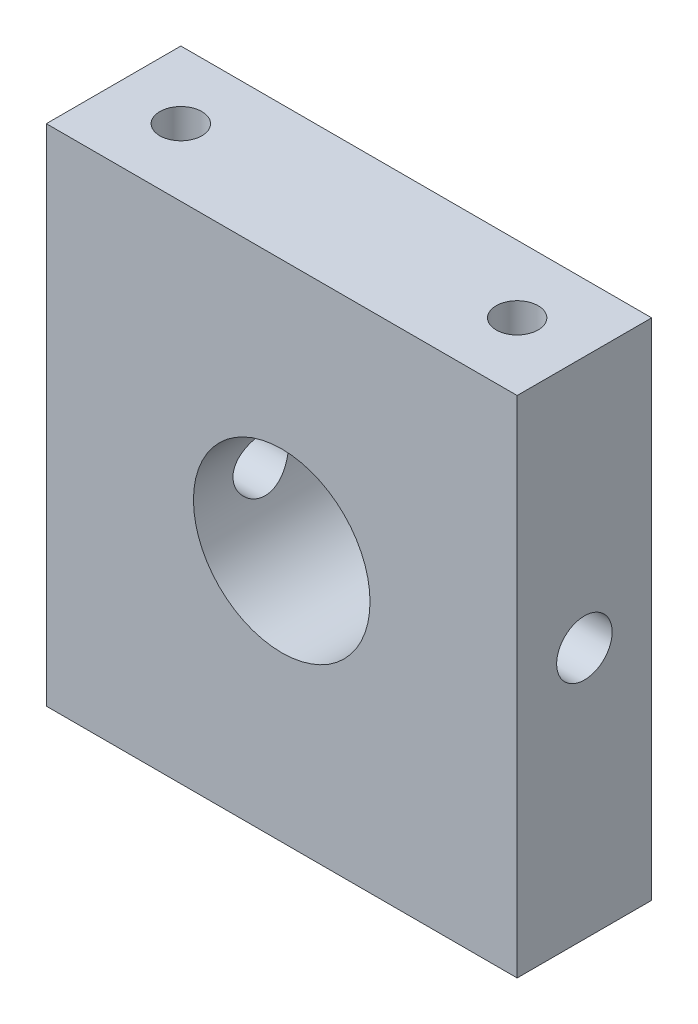
ISO-10303-21;
HEADER;
FILE_DESCRIPTION(('STEP AP214'),'2;1');
FILE_NAME('part.step','',(''),(''),'','','');
FILE_SCHEMA(('AUTOMOTIVE_DESIGN { 1 0 10303 214 1 1 1 1 }'));
ENDSEC;
DATA;
#1=APPLICATION_CONTEXT('core data for automotive mechanical design processes');
#2=APPLICATION_PROTOCOL_DEFINITION('international standard','automotive_design',2000,#1);
#3=PRODUCT_CONTEXT('',#1,'mechanical');
#4=PRODUCT('Part','Part','',(#3));
#5=PRODUCT_RELATED_PRODUCT_CATEGORY('part','',(#4));
#6=PRODUCT_DEFINITION_FORMATION('','',#4);
#7=PRODUCT_DEFINITION_CONTEXT('part definition',#1,'design');
#8=PRODUCT_DEFINITION('design','',#6,#7);
#9=PRODUCT_DEFINITION_SHAPE('','',#8);
#10=(LENGTH_UNIT() NAMED_UNIT(*) SI_UNIT(.MILLI.,.METRE.));
#11=(NAMED_UNIT(*) PLANE_ANGLE_UNIT() SI_UNIT($,.RADIAN.));
#12=(NAMED_UNIT(*) SI_UNIT($,.STERADIAN.) SOLID_ANGLE_UNIT());
#13=UNCERTAINTY_MEASURE_WITH_UNIT(LENGTH_MEASURE(1.E-05),#10,'distance_accuracy_value','');
#14=(GEOMETRIC_REPRESENTATION_CONTEXT(3) GLOBAL_UNCERTAINTY_ASSIGNED_CONTEXT((#13)) GLOBAL_UNIT_ASSIGNED_CONTEXT((#10,
#11,#12)) REPRESENTATION_CONTEXT('',''));
#15=CARTESIAN_POINT('',(0.,0.,0.));
#16=DIRECTION('',(0.,0.,1.));
#17=DIRECTION('',(1.,0.,0.));
#18=AXIS2_PLACEMENT_3D('',#15,#16,#17);
#19=CARTESIAN_POINT('',(0.,0.,8.));
#20=DIRECTION('',(0.,0.,-1.));
#21=DIRECTION('',(-1.,0.,0.));
#22=AXIS2_PLACEMENT_3D('',#19,#20,#21);
#23=PLANE('',#22);
#24=DIRECTION('',(0.,1.,0.));
#25=VECTOR('',#24,1.);
#26=CARTESIAN_POINT('',(14.,-15.,8.));
#27=LINE('',#26,#25);
#28=CARTESIAN_POINT('',(14.,-15.,8.));
#29=VERTEX_POINT('',#28);
#30=CARTESIAN_POINT('',(14.,15.,8.));
#31=VERTEX_POINT('',#30);
#32=EDGE_CURVE('E146',#29,#31,#27,.T.);
#33=ORIENTED_EDGE('',*,*,#32,.T.);
#34=DIRECTION('',(-1.,0.,0.));
#35=VECTOR('',#34,1.);
#36=CARTESIAN_POINT('',(-14.,15.,8.));
#37=LINE('',#36,#35);
#38=CARTESIAN_POINT('',(-14.,15.,8.));
#39=VERTEX_POINT('',#38);
#40=EDGE_CURVE('E92',#31,#39,#37,.T.);
#41=ORIENTED_EDGE('',*,*,#40,.T.);
#42=DIRECTION('',(0.,-1.,0.));
#43=VECTOR('',#42,1.);
#44=CARTESIAN_POINT('',(-14.,-15.,8.));
#45=LINE('',#44,#43);
#46=CARTESIAN_POINT('',(-14.,-15.,8.));
#47=VERTEX_POINT('',#46);
#48=EDGE_CURVE('E149',#39,#47,#45,.T.);
#49=ORIENTED_EDGE('',*,*,#48,.T.);
#50=DIRECTION('',(1.,0.,0.));
#51=VECTOR('',#50,1.);
#52=CARTESIAN_POINT('',(-14.,-15.,8.));
#53=LINE('',#52,#51);
#54=EDGE_CURVE('E61',#47,#29,#53,.T.);
#55=ORIENTED_EDGE('',*,*,#54,.T.);
#56=EDGE_LOOP('',(#33,#41,#49,#55));
#57=FACE_BOUND('',#56,.T.);
#58=CARTESIAN_POINT('',(0.,0.,8.));
#59=DIRECTION('',(0.,0.,1.));
#60=DIRECTION('',(1.,0.,0.));
#61=AXIS2_PLACEMENT_3D('',#58,#59,#60);
#62=CIRCLE('',#61,5.25);
#63=CARTESIAN_POINT('',(5.25,0.,8.));
#64=VERTEX_POINT('',#63);
#65=EDGE_CURVE('E140',#64,#64,#62,.T.);
#66=ORIENTED_EDGE('',*,*,#65,.F.);
#67=EDGE_LOOP('',(#66));
#68=FACE_BOUND('',#67,.T.);
#69=ADVANCED_FACE('F38',(#57,#68),#23,.F.);
#70=CARTESIAN_POINT('',(0.,0.,0.));
#71=DIRECTION('',(0.,0.,-1.));
#72=DIRECTION('',(-1.,0.,0.));
#73=AXIS2_PLACEMENT_3D('',#70,#71,#72);
#74=PLANE('',#73);
#75=DIRECTION('',(0.,1.,0.));
#76=VECTOR('',#75,1.);
#77=CARTESIAN_POINT('',(14.,-15.,0.));
#78=LINE('',#77,#76);
#79=CARTESIAN_POINT('',(14.,-15.,0.));
#80=VERTEX_POINT('',#79);
#81=CARTESIAN_POINT('',(14.,15.,0.));
#82=VERTEX_POINT('',#81);
#83=EDGE_CURVE('E143',#80,#82,#78,.T.);
#84=ORIENTED_EDGE('',*,*,#83,.F.);
#85=DIRECTION('',(1.,0.,0.));
#86=VECTOR('',#85,1.);
#87=CARTESIAN_POINT('',(-14.,-15.,0.));
#88=LINE('',#87,#86);
#89=CARTESIAN_POINT('',(-14.,-15.,0.));
#90=VERTEX_POINT('',#89);
#91=EDGE_CURVE('E85',#90,#80,#88,.T.);
#92=ORIENTED_EDGE('',*,*,#91,.F.);
#93=DIRECTION('',(0.,-1.,0.));
#94=VECTOR('',#93,1.);
#95=CARTESIAN_POINT('',(-14.,-15.,0.));
#96=LINE('',#95,#94);
#97=CARTESIAN_POINT('',(-14.,15.,0.));
#98=VERTEX_POINT('',#97);
#99=EDGE_CURVE('E79',#98,#90,#96,.T.);
#100=ORIENTED_EDGE('',*,*,#99,.F.);
#101=DIRECTION('',(-1.,0.,0.));
#102=VECTOR('',#101,1.);
#103=CARTESIAN_POINT('',(-14.,15.,0.));
#104=LINE('',#103,#102);
#105=EDGE_CURVE('E155',#82,#98,#104,.T.);
#106=ORIENTED_EDGE('',*,*,#105,.F.);
#107=EDGE_LOOP('',(#84,#92,#100,#106));
#108=FACE_BOUND('',#107,.T.);
#109=CARTESIAN_POINT('',(0.,0.,0.));
#110=DIRECTION('',(0.,0.,1.));
#111=DIRECTION('',(1.,0.,0.));
#112=AXIS2_PLACEMENT_3D('',#109,#110,#111);
#113=CIRCLE('',#112,5.25);
#114=CARTESIAN_POINT('',(5.25,0.,0.));
#115=VERTEX_POINT('',#114);
#116=EDGE_CURVE('E139',#115,#115,#113,.T.);
#117=ORIENTED_EDGE('',*,*,#116,.T.);
#118=EDGE_LOOP('',(#117));
#119=FACE_BOUND('',#118,.T.);
#120=ADVANCED_FACE('F208',(#108,#119),#74,.T.);
#121=CARTESIAN_POINT('',(14.,-15.,8.));
#122=DIRECTION('',(-1.,0.,0.));
#123=DIRECTION('',(0.,0.,1.));
#124=AXIS2_PLACEMENT_3D('',#121,#122,#123);
#125=PLANE('',#124);
#126=CARTESIAN_POINT('',(14.,0.,4.));
#127=DIRECTION('',(1.,0.,0.));
#128=DIRECTION('',(0.,0.,-1.));
#129=AXIS2_PLACEMENT_3D('',#126,#127,#128);
#130=CIRCLE('',#129,1.64999999999999);
#131=CARTESIAN_POINT('',(14.,0.,2.35000000000001));
#132=VERTEX_POINT('',#131);
#133=EDGE_CURVE('E246',#132,#132,#130,.T.);
#134=ORIENTED_EDGE('',*,*,#133,.F.);
#135=EDGE_LOOP('',(#134));
#136=FACE_BOUND('',#135,.T.);
#137=ORIENTED_EDGE('',*,*,#83,.T.);
#138=DIRECTION('',(0.,0.,-1.));
#139=VECTOR('',#138,1.);
#140=CARTESIAN_POINT('',(14.,15.,8.));
#141=LINE('',#140,#139);
#142=EDGE_CURVE('E11',#31,#82,#141,.T.);
#143=ORIENTED_EDGE('',*,*,#142,.F.);
#144=ORIENTED_EDGE('',*,*,#32,.F.);
#145=DIRECTION('',(0.,0.,-1.));
#146=VECTOR('',#145,1.);
#147=CARTESIAN_POINT('',(14.,-15.,8.));
#148=LINE('',#147,#146);
#149=EDGE_CURVE('E152',#29,#80,#148,.T.);
#150=ORIENTED_EDGE('',*,*,#149,.T.);
#151=EDGE_LOOP('',(#137,#143,#144,#150));
#152=FACE_BOUND('',#151,.T.);
#153=ADVANCED_FACE('F40',(#136,#152),#125,.F.);
#154=CARTESIAN_POINT('',(-14.,15.,8.));
#155=DIRECTION('',(0.,-1.,0.));
#156=DIRECTION('',(0.,0.,-1.));
#157=AXIS2_PLACEMENT_3D('',#154,#155,#156);
#158=PLANE('',#157);
#159=CARTESIAN_POINT('',(-10.,15.,4.));
#160=DIRECTION('',(0.,1.,0.));
#161=DIRECTION('',(0.,0.,1.));
#162=AXIS2_PLACEMENT_3D('',#159,#160,#161);
#163=CIRCLE('',#162,1.24999999999999);
#164=CARTESIAN_POINT('',(-10.,15.,5.24999999999999));
#165=VERTEX_POINT('',#164);
#166=EDGE_CURVE('E127',#165,#165,#163,.T.);
#167=ORIENTED_EDGE('',*,*,#166,.F.);
#168=EDGE_LOOP('',(#167));
#169=FACE_BOUND('',#168,.T.);
#170=CARTESIAN_POINT('',(10.,15.,4.));
#171=DIRECTION('',(0.,1.,0.));
#172=DIRECTION('',(0.,0.,1.));
#173=AXIS2_PLACEMENT_3D('',#170,#171,#172);
#174=CIRCLE('',#173,1.24999999999999);
#175=CARTESIAN_POINT('',(10.,15.,5.24999999999999));
#176=VERTEX_POINT('',#175);
#177=EDGE_CURVE('E133',#176,#176,#174,.T.);
#178=ORIENTED_EDGE('',*,*,#177,.F.);
#179=EDGE_LOOP('',(#178));
#180=FACE_BOUND('',#179,.T.);
#181=ORIENTED_EDGE('',*,*,#105,.T.);
#182=DIRECTION('',(0.,0.,-1.));
#183=VECTOR('',#182,1.);
#184=CARTESIAN_POINT('',(-14.,15.,8.));
#185=LINE('',#184,#183);
#186=EDGE_CURVE('E52',#39,#98,#185,.T.);
#187=ORIENTED_EDGE('',*,*,#186,.F.);
#188=ORIENTED_EDGE('',*,*,#40,.F.);
#189=ORIENTED_EDGE('',*,*,#142,.T.);
#190=EDGE_LOOP('',(#181,#187,#188,#189));
#191=FACE_BOUND('',#190,.T.);
#192=ADVANCED_FACE('F221',(#169,#180,#191),#158,.F.);
#193=CARTESIAN_POINT('',(-14.,-15.,8.));
#194=DIRECTION('',(1.,0.,0.));
#195=DIRECTION('',(0.,0.,-1.));
#196=AXIS2_PLACEMENT_3D('',#193,#194,#195);
#197=PLANE('',#196);
#198=CARTESIAN_POINT('',(-14.,0.,4.));
#199=DIRECTION('',(1.,0.,0.));
#200=DIRECTION('',(0.,0.,-1.));
#201=AXIS2_PLACEMENT_3D('',#198,#199,#200);
#202=CIRCLE('',#201,1.65);
#203=CARTESIAN_POINT('',(-14.,0.,2.35));
#204=VERTEX_POINT('',#203);
#205=EDGE_CURVE('E166',#204,#204,#202,.T.);
#206=ORIENTED_EDGE('',*,*,#205,.T.);
#207=EDGE_LOOP('',(#206));
#208=FACE_BOUND('',#207,.T.);
#209=ORIENTED_EDGE('',*,*,#99,.T.);
#210=DIRECTION('',(0.,0.,-1.));
#211=VECTOR('',#210,1.);
#212=CARTESIAN_POINT('',(-14.,-15.,8.));
#213=LINE('',#212,#211);
#214=EDGE_CURVE('E160',#47,#90,#213,.T.);
#215=ORIENTED_EDGE('',*,*,#214,.F.);
#216=ORIENTED_EDGE('',*,*,#48,.F.);
#217=ORIENTED_EDGE('',*,*,#186,.T.);
#218=EDGE_LOOP('',(#209,#215,#216,#217));
#219=FACE_BOUND('',#218,.T.);
#220=ADVANCED_FACE('F218',(#208,#219),#197,.F.);
#221=CARTESIAN_POINT('',(-14.,-15.,8.));
#222=DIRECTION('',(0.,1.,0.));
#223=DIRECTION('',(0.,0.,1.));
#224=AXIS2_PLACEMENT_3D('',#221,#222,#223);
#225=PLANE('',#224);
#226=CARTESIAN_POINT('',(-10.,-15.,4.));
#227=DIRECTION('',(0.,-1.,0.));
#228=DIRECTION('',(0.,0.,-1.));
#229=AXIS2_PLACEMENT_3D('',#226,#227,#228);
#230=CIRCLE('',#229,1.24999999999999);
#231=CARTESIAN_POINT('',(-10.,-15.,2.75000000000001));
#232=VERTEX_POINT('',#231);
#233=EDGE_CURVE('E116',#232,#232,#230,.T.);
#234=ORIENTED_EDGE('',*,*,#233,.F.);
#235=EDGE_LOOP('',(#234));
#236=FACE_BOUND('',#235,.T.);
#237=CARTESIAN_POINT('',(10.,-15.,4.));
#238=DIRECTION('',(0.,-1.,0.));
#239=DIRECTION('',(0.,0.,-1.));
#240=AXIS2_PLACEMENT_3D('',#237,#238,#239);
#241=CIRCLE('',#240,1.24999999999999);
#242=CARTESIAN_POINT('',(10.,-15.,2.75000000000001));
#243=VERTEX_POINT('',#242);
#244=EDGE_CURVE('E115',#243,#243,#241,.T.);
#245=ORIENTED_EDGE('',*,*,#244,.F.);
#246=EDGE_LOOP('',(#245));
#247=FACE_BOUND('',#246,.T.);
#248=ORIENTED_EDGE('',*,*,#91,.T.);
#249=ORIENTED_EDGE('',*,*,#149,.F.);
#250=ORIENTED_EDGE('',*,*,#54,.F.);
#251=ORIENTED_EDGE('',*,*,#214,.T.);
#252=EDGE_LOOP('',(#248,#249,#250,#251));
#253=FACE_BOUND('',#252,.T.);
#254=ADVANCED_FACE('F204',(#236,#247,#253),#225,.F.);
#255=CARTESIAN_POINT('',(0.,0.,8.));
#256=DIRECTION('',(0.,0.,-1.));
#257=DIRECTION('',(-1.,0.,0.));
#258=AXIS2_PLACEMENT_3D('',#255,#256,#257);
#259=CYLINDRICAL_SURFACE('',#258,5.25);
#260=CARTESIAN_POINT('',(-5.25,0.,5.64999999999999));
#261=CARTESIAN_POINT('',(-5.24999960184444,-0.0903138160871127,5.64999948865314));
#262=CARTESIAN_POINT('',(-5.24764759134858,-0.180633091099497,5.64256051294661));
#263=CARTESIAN_POINT('',(-5.23849548865281,-0.358628728280969,5.61308023685966));
#264=CARTESIAN_POINT('',(-5.23169443583003,-0.446304515398941,5.59103578289835));
#265=CARTESIAN_POINT('',(-5.21438688401021,-0.616420781166709,5.5331625073438));
#266=CARTESIAN_POINT('',(-5.20388616143931,-0.698869186071804,5.49735516635705));
#267=CARTESIAN_POINT('',(-5.18026244103505,-0.85659145475939,5.41306442472808));
#268=CARTESIAN_POINT('',(-5.16713902097703,-0.931864160449762,5.36457898266676));
#269=CARTESIAN_POINT('',(-5.13920395609546,-1.0754471886397,5.25471623213628));
#270=CARTESIAN_POINT('',(-5.12435521853942,-1.14350224364963,5.19301477567238));
#271=CARTESIAN_POINT('',(-5.09485699525044,-1.26848899451305,5.05916156463858));
#272=CARTESIAN_POINT('',(-5.08020754763717,-1.3254185893941,4.98700784069543));
#273=CARTESIAN_POINT('',(-5.05236771727594,-1.42792858161664,4.83208107045799));
#274=CARTESIAN_POINT('',(-5.03922306842378,-1.47318901148381,4.74908731311407));
#275=CARTESIAN_POINT('',(-5.01643952400536,-1.549003873656,4.57618630702375));
#276=CARTESIAN_POINT('',(-5.00679969307553,-1.57956223034578,4.48628091062211));
#277=CARTESIAN_POINT('',(-4.99250544866073,-1.6241694789327,4.30499116418492));
#278=CARTESIAN_POINT('',(-4.98770830125241,-1.63869230409497,4.21373499708649));
#279=CARTESIAN_POINT('',(-4.98321892065324,-1.65229695947012,4.02996496128375));
#280=CARTESIAN_POINT('',(-4.9835253124342,-1.65138294877321,3.9374514380561));
#281=CARTESIAN_POINT('',(-4.98908247735357,-1.63451033101149,3.75772311855933));
#282=CARTESIAN_POINT('',(-4.99413481023862,-1.61915550195805,3.67044446891003));
#283=CARTESIAN_POINT('',(-5.00829202006905,-1.57481655833589,3.49977093338869));
#284=CARTESIAN_POINT('',(-5.01739733221004,-1.54583098012319,3.41637646564988));
#285=CARTESIAN_POINT('',(-5.03878574520165,-1.47462957750573,3.254405810647));
#286=CARTESIAN_POINT('',(-5.05111370187026,-1.43222506454117,3.1759187475004));
#287=CARTESIAN_POINT('',(-5.07753795007311,-1.33552053640518,3.02697683408021));
#288=CARTESIAN_POINT('',(-5.09163470495754,-1.28121740150698,2.95652409772474));
#289=CARTESIAN_POINT('',(-5.12080300782606,-1.15929958682412,2.82223901316389));
#290=CARTESIAN_POINT('',(-5.13588954350284,-1.09118686267386,2.75886125653778));
#291=CARTESIAN_POINT('',(-5.16476508836269,-0.94511226915566,2.6443164842873));
#292=CARTESIAN_POINT('',(-5.17855399915628,-0.867149653990149,2.59315039413387));
#293=CARTESIAN_POINT('',(-5.20342831675405,-0.702704948994522,2.50416860056265));
#294=CARTESIAN_POINT('',(-5.21449132434183,-0.616159969945947,2.46646243550637));
#295=CARTESIAN_POINT('',(-5.23250557914234,-0.437526752559026,2.40627929328827));
#296=CARTESIAN_POINT('',(-5.23945808969179,-0.345440226978746,2.3837976366555));
#297=CARTESIAN_POINT('',(-5.2482642022994,-0.162195746821329,2.35547863856952));
#298=CARTESIAN_POINT('',(-5.25030620181293,-0.0711417992037803,2.34902598828777));
#299=CARTESIAN_POINT('',(-5.24961906163555,0.110758249141408,2.35121181760298));
#300=CARTESIAN_POINT('',(-5.24689062779595,0.201604378627123,2.35984806458959));
#301=CARTESIAN_POINT('',(-5.23709304145135,0.378129215830966,2.39147312861814));
#302=CARTESIAN_POINT('',(-5.23013498384316,0.463880448509585,2.41409485538196));
#303=CARTESIAN_POINT('',(-5.21269363771162,0.630345480346761,2.47259988856735));
#304=CARTESIAN_POINT('',(-5.2022099123552,0.711058653815787,2.50848483836751));
#305=CARTESIAN_POINT('',(-5.17847385402069,0.867360962558111,2.59348199714268));
#306=CARTESIAN_POINT('',(-5.16515986483723,0.942775634665184,2.64289733513479));
#307=CARTESIAN_POINT('',(-5.13728468377683,1.08444816355674,2.75318951841225));
#308=CARTESIAN_POINT('',(-5.12272315056732,1.15070350127134,2.81406950596093));
#309=CARTESIAN_POINT('',(-5.0932585110863,1.27493568277297,2.94845707253028));
#310=CARTESIAN_POINT('',(-5.07836512991463,1.33247390311172,3.02237318877114));
#311=CARTESIAN_POINT('',(-5.05053275336343,1.43437044939649,3.1791351295577));
#312=CARTESIAN_POINT('',(-5.03759373030031,1.47872896204242,3.26198082758687));
#313=CARTESIAN_POINT('',(-5.01527749651469,1.55273603802829,3.43409428784431));
#314=CARTESIAN_POINT('',(-5.00588699282645,1.58243963006172,3.52333656205621));
#315=CARTESIAN_POINT('',(-4.99181560482065,1.62628952037382,3.70591234659813));
#316=CARTESIAN_POINT('',(-4.98713290181811,1.64044182651427,3.79924426249353));
#317=CARTESIAN_POINT('',(-4.98319829004662,1.65235277135103,3.98276038691123));
#318=CARTESIAN_POINT('',(-4.98370777222866,1.65083165198896,4.07289330588769));
#319=CARTESIAN_POINT('',(-4.9895196162268,1.6331804457886,4.25155166899396));
#320=CARTESIAN_POINT('',(-4.99482174963332,1.61705105515554,4.34007718952454));
#321=CARTESIAN_POINT('',(-5.00945380521962,1.57112569952172,4.51170368283665));
#322=CARTESIAN_POINT('',(-5.0187221985215,1.54153808871411,4.59486605203611));
#323=CARTESIAN_POINT('',(-5.04022613647117,1.46970059274635,4.75511231996557));
#324=CARTESIAN_POINT('',(-5.05246228952545,1.42744811080099,4.83219496802102));
#325=CARTESIAN_POINT('',(-5.07912615580566,1.32952828819627,4.98139072762776));
#326=CARTESIAN_POINT('',(-5.09362135445328,1.27339690070269,5.05318718170565));
#327=CARTESIAN_POINT('',(-5.12286211099516,1.15012648415973,5.18657494955217));
#328=CARTESIAN_POINT('',(-5.1376077352039,1.08298449735964,5.24816351223652));
#329=CARTESIAN_POINT('',(-5.16627458164346,0.936920083510463,5.36143308350787));
#330=CARTESIAN_POINT('',(-5.18015224567742,0.857680817165493,5.41271778174051));
#331=CARTESIAN_POINT('',(-5.20496937883864,0.691270072882735,5.50117156856197));
#332=CARTESIAN_POINT('',(-5.21590996987208,0.604101640819365,5.53834604923855));
#333=CARTESIAN_POINT('',(-5.23288601403749,0.431618290552454,5.59491788089743));
#334=CARTESIAN_POINT('',(-5.23924763044946,0.346727615552823,5.61551363540761));
#335=CARTESIAN_POINT('',(-5.24780438271619,0.17455932651374,5.64305352294507));
#336=CARTESIAN_POINT('',(-5.2500003847905,0.087282212552848,5.65000049418224));
#337=CARTESIAN_POINT('',(-5.25,0.,5.64999999999999));
#338=B_SPLINE_CURVE_WITH_KNOTS('',3,(#260,#261,#262,#263,#264,#265,#266,#267,#268,#269,#270,
#271,#272,#273,#274,#275,#276,#277,#278,#279,#280,#281,#282,#283,#284,#285,#286,#287,#288,#289,
#290,#291,#292,#293,#294,#295,#296,#297,#298,#299,#300,#301,#302,#303,#304,#305,#306,#307,#308,
#309,#310,#311,#312,#313,#314,#315,#316,#317,#318,#319,#320,#321,#322,#323,#324,#325,#326,#327,
#328,#329,#330,#331,#332,#333,#334,#335,#336,#337),.UNSPECIFIED.,.T.,.F.,(4,2,2,2,2,2,2,2,2,2,2,
2,2,2,2,2,2,2,2,2,2,2,2,2,2,2,2,2,2,2,2,2,2,2,2,2,2,2,4),(0.,0.270620596072465,
0.541299642965311,0.811557928321982,1.08185975730781,1.35976161798403,1.63771590805519,
1.92263190816446,2.20747181416156,2.4836470199344,2.75974781801937,3.02479487283419,
3.28987039439966,3.55885253709253,3.82790528939643,4.10935449716703,4.3908250280234,
4.67453660713042,4.958160943788,5.23071678581622,5.50323230286585,5.76888188195813,
6.03456438738084,6.30677004143701,6.57905041125649,6.86225155948008,7.14544869576699,
7.42757418651519,7.70959064656823,7.97870759331101,8.24781171507518,8.51288447704252,
8.77801162633242,9.05361351737495,9.32928956432788,9.61410809218883,9.89881766946957,
10.1604086276786,10.4219451833347),.UNSPECIFIED.);
#339=CARTESIAN_POINT('',(-5.25,0.,5.64999999999999));
#340=VERTEX_POINT('',#339);
#341=EDGE_CURVE('E42',#340,#340,#338,.T.);
#342=ORIENTED_EDGE('',*,*,#341,.F.);
#343=EDGE_LOOP('',(#342));
#344=FACE_BOUND('',#343,.T.);
#345=CARTESIAN_POINT('',(5.25,0.,2.35000000000001));
#346=CARTESIAN_POINT('',(5.24999960184443,-0.0903138160871127,2.35000051134686));
#347=CARTESIAN_POINT('',(5.24764759134858,-0.180633091099497,2.35743948705339));
#348=CARTESIAN_POINT('',(5.2384954886528,-0.358628728280969,2.38691976314034));
#349=CARTESIAN_POINT('',(5.23169443583002,-0.446304515398941,2.40896421710165));
#350=CARTESIAN_POINT('',(5.21438688401021,-0.616420781166709,2.4668374926562));
#351=CARTESIAN_POINT('',(5.20388616143931,-0.698869186071804,2.50264483364296));
#352=CARTESIAN_POINT('',(5.18026244103504,-0.85659145475939,2.58693557527192));
#353=CARTESIAN_POINT('',(5.16713902097703,-0.931864160449762,2.63542101733324));
#354=CARTESIAN_POINT('',(5.13920395609546,-1.0754471886397,2.74528376786372));
#355=CARTESIAN_POINT('',(5.12435521853941,-1.14350224364963,2.80698522432762));
#356=CARTESIAN_POINT('',(5.09485699525043,-1.26848899451305,2.94083843536142));
#357=CARTESIAN_POINT('',(5.08020754763717,-1.3254185893941,3.01299215930457));
#358=CARTESIAN_POINT('',(5.05236771727593,-1.42792858161664,3.16791892954201));
#359=CARTESIAN_POINT('',(5.03922306842378,-1.47318901148381,3.25091268688593));
#360=CARTESIAN_POINT('',(5.01643952400535,-1.549003873656,3.42381369297625));
#361=CARTESIAN_POINT('',(5.00679969307552,-1.57956223034578,3.51371908937789));
#362=CARTESIAN_POINT('',(4.99250544866072,-1.6241694789327,3.69500883581508));
#363=CARTESIAN_POINT('',(4.9877083012524,-1.63869230409497,3.78626500291351));
#364=CARTESIAN_POINT('',(4.98321892065324,-1.65229695947012,3.97003503871625));
#365=CARTESIAN_POINT('',(4.9835253124342,-1.65138294877321,4.0625485619439));
#366=CARTESIAN_POINT('',(4.98908247735356,-1.63451033101149,4.24227688144067));
#367=CARTESIAN_POINT('',(4.99413481023861,-1.61915550195805,4.32955553108997));
#368=CARTESIAN_POINT('',(5.00829202006905,-1.57481655833589,4.50022906661131));
#369=CARTESIAN_POINT('',(5.01739733221003,-1.54583098012319,4.58362353435012));
#370=CARTESIAN_POINT('',(5.03878574520164,-1.47462957750573,4.745594189353));
#371=CARTESIAN_POINT('',(5.05111370187026,-1.43222506454117,4.8240812524996));
#372=CARTESIAN_POINT('',(5.0775379500731,-1.33552053640518,4.97302316591979));
#373=CARTESIAN_POINT('',(5.09163470495753,-1.28121740150698,5.04347590227527));
#374=CARTESIAN_POINT('',(5.12080300782605,-1.15929958682412,5.17776098683611));
#375=CARTESIAN_POINT('',(5.13588954350283,-1.09118686267387,5.24113874346222));
#376=CARTESIAN_POINT('',(5.16476508836269,-0.945112269155661,5.3556835157127));
#377=CARTESIAN_POINT('',(5.17855399915628,-0.867149653990149,5.40684960586613));
#378=CARTESIAN_POINT('',(5.20342831675405,-0.702704948994521,5.49583139943735));
#379=CARTESIAN_POINT('',(5.21449132434182,-0.616159969945946,5.53353756449363));
#380=CARTESIAN_POINT('',(5.23250557914233,-0.437526752559026,5.59372070671173));
#381=CARTESIAN_POINT('',(5.23945808969179,-0.345440226978746,5.6162023633445));
#382=CARTESIAN_POINT('',(5.24826420229939,-0.16219574682133,5.64452136143048));
#383=CARTESIAN_POINT('',(5.25030620181293,-0.0711417992037809,5.65097401171223));
#384=CARTESIAN_POINT('',(5.24961906163554,0.110758249141407,5.64878818239702));
#385=CARTESIAN_POINT('',(5.24689062779595,0.201604378627123,5.64015193541041));
#386=CARTESIAN_POINT('',(5.23709304145134,0.378129215830966,5.60852687138186));
#387=CARTESIAN_POINT('',(5.23013498384316,0.463880448509585,5.58590514461804));
#388=CARTESIAN_POINT('',(5.21269363771162,0.630345480346761,5.52740011143265));
#389=CARTESIAN_POINT('',(5.20220991235519,0.711058653815787,5.49151516163248));
#390=CARTESIAN_POINT('',(5.17847385402069,0.867360962558111,5.40651800285732));
#391=CARTESIAN_POINT('',(5.16515986483723,0.942775634665184,5.35710266486521));
#392=CARTESIAN_POINT('',(5.13728468377683,1.08444816355674,5.24681048158775));
#393=CARTESIAN_POINT('',(5.12272315056732,1.15070350127134,5.18593049403907));
#394=CARTESIAN_POINT('',(5.0932585110863,1.27493568277297,5.05154292746972));
#395=CARTESIAN_POINT('',(5.07836512991463,1.33247390311172,4.97762681122886));
#396=CARTESIAN_POINT('',(5.05053275336343,1.43437044939649,4.8208648704423));
#397=CARTESIAN_POINT('',(5.0375937303003,1.47872896204242,4.73801917241312));
#398=CARTESIAN_POINT('',(5.01527749651469,1.55273603802829,4.56590571215569));
#399=CARTESIAN_POINT('',(5.00588699282644,1.58243963006172,4.47666343794378));
#400=CARTESIAN_POINT('',(4.99181560482064,1.62628952037382,4.29408765340187));
#401=CARTESIAN_POINT('',(4.9871329018181,1.64044182651427,4.20075573750647));
#402=CARTESIAN_POINT('',(4.98319829004662,1.65235277135103,4.01723961308877));
#403=CARTESIAN_POINT('',(4.98370777222865,1.65083165198896,3.92710669411231));
#404=CARTESIAN_POINT('',(4.98951961622679,1.6331804457886,3.74844833100604));
#405=CARTESIAN_POINT('',(4.99482174963332,1.61705105515554,3.65992281047545));
#406=CARTESIAN_POINT('',(5.00945380521962,1.57112569952172,3.48829631716335));
#407=CARTESIAN_POINT('',(5.0187221985215,1.54153808871411,3.40513394796389));
#408=CARTESIAN_POINT('',(5.04022613647116,1.46970059274635,3.24488768003443));
#409=CARTESIAN_POINT('',(5.05246228952544,1.42744811080099,3.16780503197898));
#410=CARTESIAN_POINT('',(5.07912615580566,1.32952828819627,3.01860927237224));
#411=CARTESIAN_POINT('',(5.09362135445328,1.27339690070269,2.94681281829435));
#412=CARTESIAN_POINT('',(5.12286211099516,1.15012648415973,2.81342505044783));
#413=CARTESIAN_POINT('',(5.1376077352039,1.08298449735964,2.75183648776348));
#414=CARTESIAN_POINT('',(5.16627458164345,0.936920083510461,2.63856691649213));
#415=CARTESIAN_POINT('',(5.18015224567742,0.857680817165491,2.58728221825949));
#416=CARTESIAN_POINT('',(5.20496937883864,0.691270072882734,2.49882843143803));
#417=CARTESIAN_POINT('',(5.21590996987207,0.604101640819364,2.46165395076145));
#418=CARTESIAN_POINT('',(5.23288601403748,0.431618290552453,2.40508211910257));
#419=CARTESIAN_POINT('',(5.23924763044945,0.346727615552823,2.38448636459239));
#420=CARTESIAN_POINT('',(5.24780438271618,0.17455932651374,2.35694647705493));
#421=CARTESIAN_POINT('',(5.2500003847905,0.0872822125528481,2.34999950581776));
#422=CARTESIAN_POINT('',(5.25,0.,2.35000000000001));
#423=B_SPLINE_CURVE_WITH_KNOTS('',3,(#345,#346,#347,#348,#349,#350,#351,#352,#353,#354,#355,
#356,#357,#358,#359,#360,#361,#362,#363,#364,#365,#366,#367,#368,#369,#370,#371,#372,#373,#374,
#375,#376,#377,#378,#379,#380,#381,#382,#383,#384,#385,#386,#387,#388,#389,#390,#391,#392,#393,
#394,#395,#396,#397,#398,#399,#400,#401,#402,#403,#404,#405,#406,#407,#408,#409,#410,#411,#412,
#413,#414,#415,#416,#417,#418,#419,#420,#421,#422),.UNSPECIFIED.,.T.,.F.,(4,2,2,2,2,2,2,2,2,2,2,
2,2,2,2,2,2,2,2,2,2,2,2,2,2,2,2,2,2,2,2,2,2,2,2,2,2,2,4),(0.,0.270620596072465,
0.541299642965311,0.811557928321982,1.08185975730781,1.35976161798403,1.63771590805519,
1.92263190816446,2.20747181416156,2.4836470199344,2.75974781801937,3.02479487283419,
3.28987039439966,3.55885253709253,3.82790528939643,4.10935449716703,4.3908250280234,
4.67453660713042,4.958160943788,5.23071678581622,5.50323230286585,5.76888188195813,
6.03456438738084,6.30677004143701,6.57905041125649,6.86225155948008,7.14544869576699,
7.42757418651519,7.70959064656823,7.97870759331101,8.24781171507519,8.51288447704252,
8.77801162633242,9.05361351737496,9.32928956432788,9.61410809218883,9.89881766946957,
10.1604086276786,10.4219451833347),.UNSPECIFIED.);
#424=CARTESIAN_POINT('',(5.25,0.,2.35000000000001));
#425=VERTEX_POINT('',#424);
#426=EDGE_CURVE('E162',#425,#425,#423,.T.);
#427=ORIENTED_EDGE('',*,*,#426,.F.);
#428=EDGE_LOOP('',(#427));
#429=FACE_BOUND('',#428,.T.);
#430=ORIENTED_EDGE('',*,*,#65,.T.);
#431=EDGE_LOOP('',(#430));
#432=FACE_BOUND('',#431,.T.);
#433=ORIENTED_EDGE('',*,*,#116,.F.);
#434=EDGE_LOOP('',(#433));
#435=FACE_BOUND('',#434,.T.);
#436=ADVANCED_FACE('F167',(#344,#429,#432,#435),#259,.F.);
#437=CARTESIAN_POINT('',(10.,3.5,4.));
#438=DIRECTION('',(0.,1.,0.));
#439=DIRECTION('',(0.,0.,1.));
#440=AXIS2_PLACEMENT_3D('',#437,#438,#439);
#441=CONICAL_SURFACE('',#440,1.25,1.02974425867665);
#442=CARTESIAN_POINT('',(10.,2.74892422621555,4.));
#443=VERTEX_POINT('',#442);
#444=VERTEX_LOOP('',#443);
#445=FACE_BOUND('',#444,.T.);
#446=CARTESIAN_POINT('',(10.,3.5,4.));
#447=DIRECTION('',(0.,1.,0.));
#448=DIRECTION('',(0.,0.,1.));
#449=AXIS2_PLACEMENT_3D('',#446,#447,#448);
#450=CIRCLE('',#449,1.25);
#451=CARTESIAN_POINT('',(10.,3.5,5.25));
#452=VERTEX_POINT('',#451);
#453=EDGE_CURVE('E136',#452,#452,#450,.T.);
#454=ORIENTED_EDGE('',*,*,#453,.T.);
#455=EDGE_LOOP('',(#454));
#456=FACE_BOUND('',#455,.T.);
#457=ADVANCED_FACE('F197',(#445,#456),#441,.F.);
#458=CARTESIAN_POINT('',(10.,15.,4.));
#459=DIRECTION('',(0.,1.,0.));
#460=DIRECTION('',(0.,0.,1.));
#461=AXIS2_PLACEMENT_3D('',#458,#459,#460);
#462=CYLINDRICAL_SURFACE('',#461,1.24999999999999);
#463=ORIENTED_EDGE('',*,*,#453,.F.);
#464=EDGE_LOOP('',(#463));
#465=FACE_BOUND('',#464,.T.);
#466=ORIENTED_EDGE('',*,*,#177,.T.);
#467=EDGE_LOOP('',(#466));
#468=FACE_BOUND('',#467,.T.);
#469=ADVANCED_FACE('F194',(#465,#468),#462,.F.);
#470=CARTESIAN_POINT('',(-10.,3.5,4.));
#471=DIRECTION('',(0.,1.,0.));
#472=DIRECTION('',(0.,0.,1.));
#473=AXIS2_PLACEMENT_3D('',#470,#471,#472);
#474=CONICAL_SURFACE('',#473,1.25,1.02974425867665);
#475=CARTESIAN_POINT('',(-10.,2.74892422621555,4.));
#476=VERTEX_POINT('',#475);
#477=VERTEX_LOOP('',#476);
#478=FACE_BOUND('',#477,.T.);
#479=CARTESIAN_POINT('',(-10.,3.5,4.));
#480=DIRECTION('',(0.,1.,0.));
#481=DIRECTION('',(0.,0.,1.));
#482=AXIS2_PLACEMENT_3D('',#479,#480,#481);
#483=CIRCLE('',#482,1.25);
#484=CARTESIAN_POINT('',(-10.,3.5,5.25));
#485=VERTEX_POINT('',#484);
#486=EDGE_CURVE('E130',#485,#485,#483,.T.);
#487=ORIENTED_EDGE('',*,*,#486,.T.);
#488=EDGE_LOOP('',(#487));
#489=FACE_BOUND('',#488,.T.);
#490=ADVANCED_FACE('F190',(#478,#489),#474,.F.);
#491=CARTESIAN_POINT('',(-10.,15.,4.));
#492=DIRECTION('',(0.,1.,0.));
#493=DIRECTION('',(0.,0.,1.));
#494=AXIS2_PLACEMENT_3D('',#491,#492,#493);
#495=CYLINDRICAL_SURFACE('',#494,1.24999999999999);
#496=ORIENTED_EDGE('',*,*,#486,.F.);
#497=EDGE_LOOP('',(#496));
#498=FACE_BOUND('',#497,.T.);
#499=ORIENTED_EDGE('',*,*,#166,.T.);
#500=EDGE_LOOP('',(#499));
#501=FACE_BOUND('',#500,.T.);
#502=ADVANCED_FACE('F186',(#498,#501),#495,.F.);
#503=CARTESIAN_POINT('',(10.,-3.5,4.));
#504=DIRECTION('',(0.,-1.,0.));
#505=DIRECTION('',(0.,0.,-1.));
#506=AXIS2_PLACEMENT_3D('',#503,#504,#505);
#507=CONICAL_SURFACE('',#506,1.24999999999999,1.02974425867665);
#508=CARTESIAN_POINT('',(10.,-2.74892422621555,4.));
#509=VERTEX_POINT('',#508);
#510=VERTEX_LOOP('',#509);
#511=FACE_BOUND('',#510,.T.);
#512=CARTESIAN_POINT('',(10.,-3.5,4.));
#513=DIRECTION('',(0.,-1.,0.));
#514=DIRECTION('',(0.,0.,-1.));
#515=AXIS2_PLACEMENT_3D('',#512,#513,#514);
#516=CIRCLE('',#515,1.24999999999999);
#517=CARTESIAN_POINT('',(10.,-3.5,2.75000000000001));
#518=VERTEX_POINT('',#517);
#519=EDGE_CURVE('E119',#518,#518,#516,.T.);
#520=ORIENTED_EDGE('',*,*,#519,.T.);
#521=EDGE_LOOP('',(#520));
#522=FACE_BOUND('',#521,.T.);
#523=ADVANCED_FACE('F182',(#511,#522),#507,.F.);
#524=CARTESIAN_POINT('',(10.,-15.,4.));
#525=DIRECTION('',(0.,-1.,0.));
#526=DIRECTION('',(0.,0.,-1.));
#527=AXIS2_PLACEMENT_3D('',#524,#525,#526);
#528=CYLINDRICAL_SURFACE('',#527,1.24999999999999);
#529=ORIENTED_EDGE('',*,*,#519,.F.);
#530=EDGE_LOOP('',(#529));
#531=FACE_BOUND('',#530,.T.);
#532=ORIENTED_EDGE('',*,*,#244,.T.);
#533=EDGE_LOOP('',(#532));
#534=FACE_BOUND('',#533,.T.);
#535=ADVANCED_FACE('F109',(#531,#534),#528,.F.);
#536=CARTESIAN_POINT('',(-10.,-3.5,4.));
#537=DIRECTION('',(0.,-1.,0.));
#538=DIRECTION('',(0.,0.,-1.));
#539=AXIS2_PLACEMENT_3D('',#536,#537,#538);
#540=CONICAL_SURFACE('',#539,1.24999999999999,1.02974425867665);
#541=CARTESIAN_POINT('',(-10.,-2.74892422621555,4.));
#542=VERTEX_POINT('',#541);
#543=VERTEX_LOOP('',#542);
#544=FACE_BOUND('',#543,.T.);
#545=CARTESIAN_POINT('',(-10.,-3.5,4.));
#546=DIRECTION('',(0.,-1.,0.));
#547=DIRECTION('',(0.,0.,-1.));
#548=AXIS2_PLACEMENT_3D('',#545,#546,#547);
#549=CIRCLE('',#548,1.24999999999999);
#550=CARTESIAN_POINT('',(-10.,-3.5,2.75000000000001));
#551=VERTEX_POINT('',#550);
#552=EDGE_CURVE('E113',#551,#551,#549,.T.);
#553=ORIENTED_EDGE('',*,*,#552,.T.);
#554=EDGE_LOOP('',(#553));
#555=FACE_BOUND('',#554,.T.);
#556=ADVANCED_FACE('F105',(#544,#555),#540,.F.);
#557=CARTESIAN_POINT('',(-10.,-15.,4.));
#558=DIRECTION('',(0.,-1.,0.));
#559=DIRECTION('',(0.,0.,-1.));
#560=AXIS2_PLACEMENT_3D('',#557,#558,#559);
#561=CYLINDRICAL_SURFACE('',#560,1.24999999999999);
#562=ORIENTED_EDGE('',*,*,#552,.F.);
#563=EDGE_LOOP('',(#562));
#564=FACE_BOUND('',#563,.T.);
#565=ORIENTED_EDGE('',*,*,#233,.T.);
#566=EDGE_LOOP('',(#565));
#567=FACE_BOUND('',#566,.T.);
#568=ADVANCED_FACE('F108',(#564,#567),#561,.F.);
#569=CARTESIAN_POINT('',(14.,0.,4.));
#570=DIRECTION('',(1.,0.,0.));
#571=DIRECTION('',(0.,0.,-1.));
#572=AXIS2_PLACEMENT_3D('',#569,#570,#571);
#573=CYLINDRICAL_SURFACE('',#572,1.64999999999999);
#574=ORIENTED_EDGE('',*,*,#426,.T.);
#575=EDGE_LOOP('',(#574));
#576=FACE_BOUND('',#575,.T.);
#577=ORIENTED_EDGE('',*,*,#133,.T.);
#578=EDGE_LOOP('',(#577));
#579=FACE_BOUND('',#578,.T.);
#580=ADVANCED_FACE('F171',(#576,#579),#573,.F.);
#581=ORIENTED_EDGE('',*,*,#341,.T.);
#582=EDGE_LOOP('',(#581));
#583=FACE_BOUND('',#582,.T.);
#584=ORIENTED_EDGE('',*,*,#205,.F.);
#585=EDGE_LOOP('',(#584));
#586=FACE_BOUND('',#585,.T.);
#587=ADVANCED_FACE('F175',(#583,#586),#573,.F.);
#588=CLOSED_SHELL('',(#69,#120,#153,#192,#220,#254,#436,#457,#469,#490,#502,#523,#535,#556,#568,
#580,#587));
#589=MANIFOLD_SOLID_BREP('B2',#588);
#590=ADVANCED_BREP_SHAPE_REPRESENTATION('',(#18,#589),#14);
#591=SHAPE_DEFINITION_REPRESENTATION(#9,#590);
ENDSEC;
END-ISO-10303-21;
